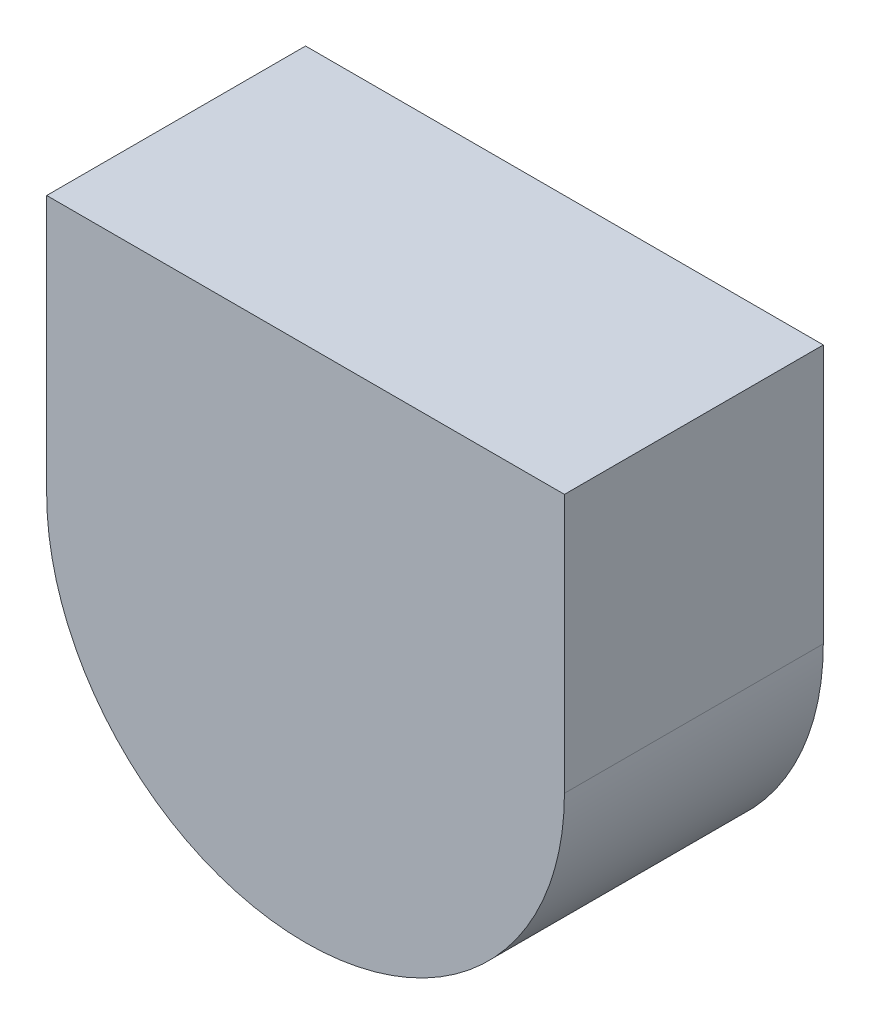
ISO-10303-21;
HEADER;
FILE_DESCRIPTION(('STEP AP214'),'2;1');
FILE_NAME('part.step','',(''),(''),'','','');
FILE_SCHEMA(('AUTOMOTIVE_DESIGN { 1 0 10303 214 1 1 1 1 }'));
ENDSEC;
DATA;
#1=APPLICATION_CONTEXT('core data for automotive mechanical design processes');
#2=APPLICATION_PROTOCOL_DEFINITION('international standard','automotive_design',2000,#1);
#3=PRODUCT_CONTEXT('',#1,'mechanical');
#4=PRODUCT('Part','Part','',(#3));
#5=PRODUCT_RELATED_PRODUCT_CATEGORY('part','',(#4));
#6=PRODUCT_DEFINITION_FORMATION('','',#4);
#7=PRODUCT_DEFINITION_CONTEXT('part definition',#1,'design');
#8=PRODUCT_DEFINITION('design','',#6,#7);
#9=PRODUCT_DEFINITION_SHAPE('','',#8);
#10=(LENGTH_UNIT() NAMED_UNIT(*) SI_UNIT(.MILLI.,.METRE.));
#11=(NAMED_UNIT(*) PLANE_ANGLE_UNIT() SI_UNIT($,.RADIAN.));
#12=(NAMED_UNIT(*) SI_UNIT($,.STERADIAN.) SOLID_ANGLE_UNIT());
#13=UNCERTAINTY_MEASURE_WITH_UNIT(LENGTH_MEASURE(1.E-05),#10,'distance_accuracy_value','');
#14=(GEOMETRIC_REPRESENTATION_CONTEXT(3) GLOBAL_UNCERTAINTY_ASSIGNED_CONTEXT((#13)) GLOBAL_UNIT_ASSIGNED_CONTEXT((#10,
#11,#12)) REPRESENTATION_CONTEXT('',''));
#15=CARTESIAN_POINT('',(0.,0.,0.));
#16=DIRECTION('',(0.,0.,1.));
#17=DIRECTION('',(1.,0.,0.));
#18=AXIS2_PLACEMENT_3D('',#15,#16,#17);
#19=CARTESIAN_POINT('',(-2.54,2.54,2.54));
#20=DIRECTION('',(0.,-1.,0.));
#21=DIRECTION('',(0.,0.,-1.));
#22=AXIS2_PLACEMENT_3D('',#19,#20,#21);
#23=PLANE('',#22);
#24=DIRECTION('',(-1.,0.,0.));
#25=VECTOR('',#24,1.);
#26=CARTESIAN_POINT('',(-2.54,2.54,0.));
#27=LINE('',#26,#25);
#28=CARTESIAN_POINT('',(2.54,2.54,0.));
#29=VERTEX_POINT('',#28);
#30=CARTESIAN_POINT('',(-2.54,2.54,0.));
#31=VERTEX_POINT('',#30);
#32=EDGE_CURVE('E107',#29,#31,#27,.T.);
#33=ORIENTED_EDGE('',*,*,#32,.T.);
#34=DIRECTION('',(0.,0.,-1.));
#35=VECTOR('',#34,1.);
#36=CARTESIAN_POINT('',(-2.54,2.54,2.54));
#37=LINE('',#36,#35);
#38=CARTESIAN_POINT('',(-2.54,2.54,2.54));
#39=VERTEX_POINT('',#38);
#40=EDGE_CURVE('E11',#39,#31,#37,.T.);
#41=ORIENTED_EDGE('',*,*,#40,.F.);
#42=DIRECTION('',(-1.,0.,0.));
#43=VECTOR('',#42,1.);
#44=CARTESIAN_POINT('',(-2.54,2.54,2.54));
#45=LINE('',#44,#43);
#46=CARTESIAN_POINT('',(2.54,2.54,2.54));
#47=VERTEX_POINT('',#46);
#48=EDGE_CURVE('E91',#47,#39,#45,.T.);
#49=ORIENTED_EDGE('',*,*,#48,.F.);
#50=DIRECTION('',(0.,0.,-1.));
#51=VECTOR('',#50,1.);
#52=CARTESIAN_POINT('',(2.54,2.54,2.54));
#53=LINE('',#52,#51);
#54=EDGE_CURVE('E103',#47,#29,#53,.T.);
#55=ORIENTED_EDGE('',*,*,#54,.T.);
#56=EDGE_LOOP('',(#33,#41,#49,#55));
#57=FACE_BOUND('',#56,.T.);
#58=ADVANCED_FACE('F39',(#57),#23,.F.);
#59=CARTESIAN_POINT('',(-2.54,2.54,2.54));
#60=DIRECTION('',(1.,0.,0.));
#61=DIRECTION('',(0.,0.,-1.));
#62=AXIS2_PLACEMENT_3D('',#59,#60,#61);
#63=PLANE('',#62);
#64=DIRECTION('',(0.,-1.,0.));
#65=VECTOR('',#64,1.);
#66=CARTESIAN_POINT('',(-2.54,2.54,0.));
#67=LINE('',#66,#65);
#68=CARTESIAN_POINT('',(-2.54,0.,0.));
#69=VERTEX_POINT('',#68);
#70=EDGE_CURVE('E96',#31,#69,#67,.T.);
#71=ORIENTED_EDGE('',*,*,#70,.T.);
#72=DIRECTION('',(0.,0.,-1.));
#73=VECTOR('',#72,1.);
#74=CARTESIAN_POINT('',(-2.54,0.,2.54));
#75=LINE('',#74,#73);
#76=CARTESIAN_POINT('',(-2.54,0.,2.54));
#77=VERTEX_POINT('',#76);
#78=EDGE_CURVE('E48',#77,#69,#75,.T.);
#79=ORIENTED_EDGE('',*,*,#78,.F.);
#80=DIRECTION('',(0.,-1.,0.));
#81=VECTOR('',#80,1.);
#82=CARTESIAN_POINT('',(-2.54,2.54,2.54));
#83=LINE('',#82,#81);
#84=EDGE_CURVE('E86',#39,#77,#83,.T.);
#85=ORIENTED_EDGE('',*,*,#84,.F.);
#86=ORIENTED_EDGE('',*,*,#40,.T.);
#87=EDGE_LOOP('',(#71,#79,#85,#86));
#88=FACE_BOUND('',#87,.T.);
#89=ADVANCED_FACE('F95',(#88),#63,.F.);
#90=CARTESIAN_POINT('',(0.,0.,2.54));
#91=DIRECTION('',(0.,0.,-1.));
#92=DIRECTION('',(-1.,0.,0.));
#93=AXIS2_PLACEMENT_3D('',#90,#91,#92);
#94=CYLINDRICAL_SURFACE('',#93,2.54);
#95=CARTESIAN_POINT('',(0.,0.,0.));
#96=DIRECTION('',(0.,0.,1.));
#97=DIRECTION('',(1.,0.,0.));
#98=AXIS2_PLACEMENT_3D('',#95,#96,#97);
#99=CIRCLE('',#98,2.54);
#100=CARTESIAN_POINT('',(2.54,0.,0.));
#101=VERTEX_POINT('',#100);
#102=EDGE_CURVE('E73',#69,#101,#99,.T.);
#103=ORIENTED_EDGE('',*,*,#102,.T.);
#104=DIRECTION('',(0.,0.,-1.));
#105=VECTOR('',#104,1.);
#106=CARTESIAN_POINT('',(2.54,0.,2.54));
#107=LINE('',#106,#105);
#108=CARTESIAN_POINT('',(2.54,0.,2.54));
#109=VERTEX_POINT('',#108);
#110=EDGE_CURVE('E98',#109,#101,#107,.T.);
#111=ORIENTED_EDGE('',*,*,#110,.F.);
#112=CARTESIAN_POINT('',(0.,0.,2.54));
#113=DIRECTION('',(0.,0.,1.));
#114=DIRECTION('',(1.,0.,0.));
#115=AXIS2_PLACEMENT_3D('',#112,#113,#114);
#116=CIRCLE('',#115,2.54);
#117=EDGE_CURVE('E89',#77,#109,#116,.T.);
#118=ORIENTED_EDGE('',*,*,#117,.F.);
#119=ORIENTED_EDGE('',*,*,#78,.T.);
#120=EDGE_LOOP('',(#103,#111,#118,#119));
#121=FACE_BOUND('',#120,.T.);
#122=ADVANCED_FACE('F99',(#121),#94,.T.);
#123=CARTESIAN_POINT('',(2.54,2.54,2.54));
#124=DIRECTION('',(-1.,0.,0.));
#125=DIRECTION('',(0.,0.,1.));
#126=AXIS2_PLACEMENT_3D('',#123,#124,#125);
#127=PLANE('',#126);
#128=DIRECTION('',(0.,1.,0.));
#129=VECTOR('',#128,1.);
#130=CARTESIAN_POINT('',(2.54,2.54,0.));
#131=LINE('',#130,#129);
#132=EDGE_CURVE('E79',#101,#29,#131,.T.);
#133=ORIENTED_EDGE('',*,*,#132,.T.);
#134=ORIENTED_EDGE('',*,*,#54,.F.);
#135=DIRECTION('',(0.,1.,0.));
#136=VECTOR('',#135,1.);
#137=CARTESIAN_POINT('',(2.54,2.54,2.54));
#138=LINE('',#137,#136);
#139=EDGE_CURVE('E56',#109,#47,#138,.T.);
#140=ORIENTED_EDGE('',*,*,#139,.F.);
#141=ORIENTED_EDGE('',*,*,#110,.T.);
#142=EDGE_LOOP('',(#133,#134,#140,#141));
#143=FACE_BOUND('',#142,.T.);
#144=ADVANCED_FACE('F120',(#143),#127,.F.);
#145=CARTESIAN_POINT('',(0.,0.,2.54));
#146=DIRECTION('',(0.,0.,1.));
#147=DIRECTION('',(1.,0.,0.));
#148=AXIS2_PLACEMENT_3D('',#145,#146,#147);
#149=PLANE('',#148);
#150=ORIENTED_EDGE('',*,*,#48,.T.);
#151=ORIENTED_EDGE('',*,*,#84,.T.);
#152=ORIENTED_EDGE('',*,*,#117,.T.);
#153=ORIENTED_EDGE('',*,*,#139,.T.);
#154=EDGE_LOOP('',(#150,#151,#152,#153));
#155=FACE_BOUND('',#154,.T.);
#156=ADVANCED_FACE('F87',(#155),#149,.T.);
#157=CARTESIAN_POINT('',(0.,0.,0.));
#158=DIRECTION('',(0.,0.,1.));
#159=DIRECTION('',(1.,0.,0.));
#160=AXIS2_PLACEMENT_3D('',#157,#158,#159);
#161=PLANE('',#160);
#162=ORIENTED_EDGE('',*,*,#32,.F.);
#163=ORIENTED_EDGE('',*,*,#132,.F.);
#164=ORIENTED_EDGE('',*,*,#102,.F.);
#165=ORIENTED_EDGE('',*,*,#70,.F.);
#166=EDGE_LOOP('',(#162,#163,#164,#165));
#167=FACE_BOUND('',#166,.T.);
#168=ADVANCED_FACE('F123',(#167),#161,.F.);
#169=CLOSED_SHELL('',(#58,#89,#122,#144,#156,#168));
#170=MANIFOLD_SOLID_BREP('B2',#169);
#171=ADVANCED_BREP_SHAPE_REPRESENTATION('',(#18,#170),#14);
#172=SHAPE_DEFINITION_REPRESENTATION(#9,#171);
ENDSEC;
END-ISO-10303-21;
